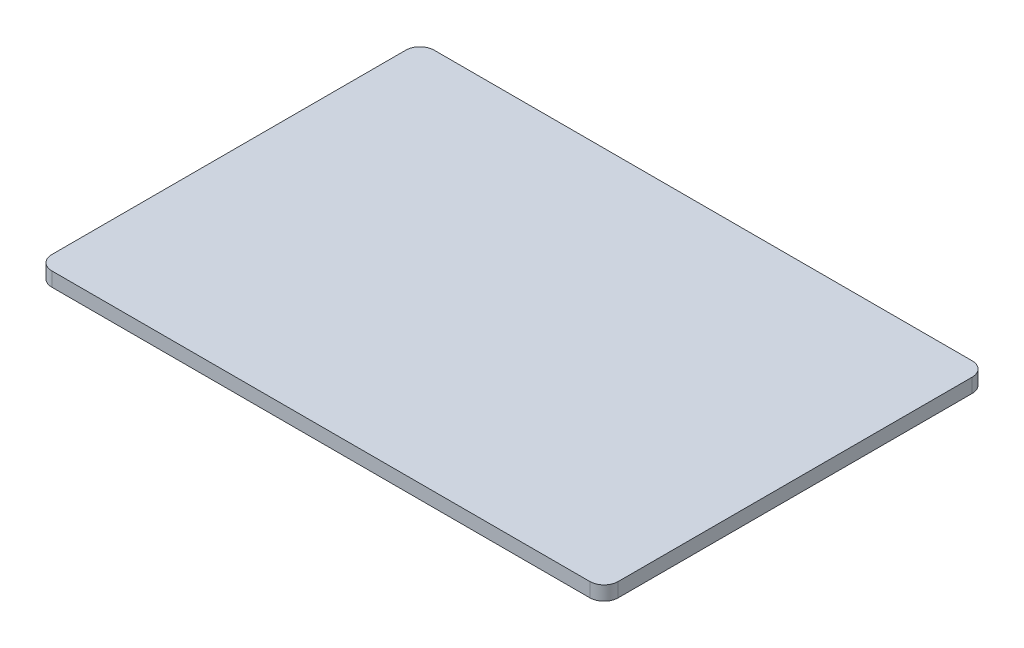
ISO-10303-21;
HEADER;
FILE_DESCRIPTION(('STEP AP214'),'2;1');
FILE_NAME('part.step','',(''),(''),'','','');
FILE_SCHEMA(('AUTOMOTIVE_DESIGN { 1 0 10303 214 1 1 1 1 }'));
ENDSEC;
DATA;
#1=APPLICATION_CONTEXT('core data for automotive mechanical design processes');
#2=APPLICATION_PROTOCOL_DEFINITION('international standard','automotive_design',2000,#1);
#3=PRODUCT_CONTEXT('',#1,'mechanical');
#4=PRODUCT('Part','Part','',(#3));
#5=PRODUCT_RELATED_PRODUCT_CATEGORY('part','',(#4));
#6=PRODUCT_DEFINITION_FORMATION('','',#4);
#7=PRODUCT_DEFINITION_CONTEXT('part definition',#1,'design');
#8=PRODUCT_DEFINITION('design','',#6,#7);
#9=PRODUCT_DEFINITION_SHAPE('','',#8);
#10=(LENGTH_UNIT() NAMED_UNIT(*) SI_UNIT(.MILLI.,.METRE.));
#11=(NAMED_UNIT(*) PLANE_ANGLE_UNIT() SI_UNIT($,.RADIAN.));
#12=(NAMED_UNIT(*) SI_UNIT($,.STERADIAN.) SOLID_ANGLE_UNIT());
#13=UNCERTAINTY_MEASURE_WITH_UNIT(LENGTH_MEASURE(1.E-05),#10,'distance_accuracy_value','');
#14=(GEOMETRIC_REPRESENTATION_CONTEXT(3) GLOBAL_UNCERTAINTY_ASSIGNED_CONTEXT((#13)) GLOBAL_UNIT_ASSIGNED_CONTEXT((#10,
#11,#12)) REPRESENTATION_CONTEXT('',''));
#15=CARTESIAN_POINT('',(0.,0.,0.));
#16=DIRECTION('',(0.,0.,1.));
#17=DIRECTION('',(1.,0.,0.));
#18=AXIS2_PLACEMENT_3D('',#15,#16,#17);
#19=CARTESIAN_POINT('',(20.,0.,13.5));
#20=DIRECTION('',(0.,1.,0.));
#21=DIRECTION('',(1.,0.,0.));
#22=AXIS2_PLACEMENT_3D('',#19,#20,#21);
#23=PLANE('',#22);
#24=CARTESIAN_POINT('',(1.,0.,1.));
#25=DIRECTION('',(0.,1.,0.));
#26=DIRECTION('',(-0.707106781186548,0.,-0.707106781186547));
#27=AXIS2_PLACEMENT_3D('',#24,#25,#26);
#28=CIRCLE('',#27,1.);
#29=CARTESIAN_POINT('',(1.,0.,0.));
#30=VERTEX_POINT('',#29);
#31=CARTESIAN_POINT('',(0.,0.,1.));
#32=VERTEX_POINT('',#31);
#33=EDGE_CURVE('E112',#30,#32,#28,.T.);
#34=ORIENTED_EDGE('',*,*,#33,.F.);
#35=DIRECTION('',(1.,0.,0.));
#36=VECTOR('',#35,1.);
#37=CARTESIAN_POINT('',(0.,0.,0.));
#38=LINE('',#37,#36);
#39=CARTESIAN_POINT('',(39.,0.,0.));
#40=VERTEX_POINT('',#39);
#41=EDGE_CURVE('E105',#30,#40,#38,.T.);
#42=ORIENTED_EDGE('',*,*,#41,.T.);
#43=CARTESIAN_POINT('',(39.,0.,1.));
#44=DIRECTION('',(0.,1.,0.));
#45=DIRECTION('',(0.707106781186546,0.,-0.707106781186549));
#46=AXIS2_PLACEMENT_3D('',#43,#44,#45);
#47=CIRCLE('',#46,1.);
#48=CARTESIAN_POINT('',(40.,0.,1.));
#49=VERTEX_POINT('',#48);
#50=EDGE_CURVE('E141',#49,#40,#47,.T.);
#51=ORIENTED_EDGE('',*,*,#50,.F.);
#52=DIRECTION('',(0.,0.,1.));
#53=VECTOR('',#52,1.);
#54=CARTESIAN_POINT('',(40.,0.,0.));
#55=LINE('',#54,#53);
#56=CARTESIAN_POINT('',(40.,0.,26.));
#57=VERTEX_POINT('',#56);
#58=EDGE_CURVE('E159',#49,#57,#55,.T.);
#59=ORIENTED_EDGE('',*,*,#58,.T.);
#60=CARTESIAN_POINT('',(39.,0.,26.));
#61=DIRECTION('',(0.,1.,0.));
#62=DIRECTION('',(0.707106781186551,0.,0.707106781186544));
#63=AXIS2_PLACEMENT_3D('',#60,#61,#62);
#64=CIRCLE('',#63,1.);
#65=CARTESIAN_POINT('',(39.,0.,27.));
#66=VERTEX_POINT('',#65);
#67=EDGE_CURVE('E131',#66,#57,#64,.T.);
#68=ORIENTED_EDGE('',*,*,#67,.F.);
#69=DIRECTION('',(-1.,0.,0.));
#70=VECTOR('',#69,1.);
#71=CARTESIAN_POINT('',(40.,0.,27.));
#72=LINE('',#71,#70);
#73=CARTESIAN_POINT('',(1.,0.,27.));
#74=VERTEX_POINT('',#73);
#75=EDGE_CURVE('E130',#66,#74,#72,.T.);
#76=ORIENTED_EDGE('',*,*,#75,.T.);
#77=CARTESIAN_POINT('',(1.,0.,26.));
#78=DIRECTION('',(0.,1.,0.));
#79=DIRECTION('',(-0.707106781186546,0.,0.707106781186549));
#80=AXIS2_PLACEMENT_3D('',#77,#78,#79);
#81=CIRCLE('',#80,1.);
#82=CARTESIAN_POINT('',(0.,0.,26.));
#83=VERTEX_POINT('',#82);
#84=EDGE_CURVE('E27',#83,#74,#81,.T.);
#85=ORIENTED_EDGE('',*,*,#84,.F.);
#86=DIRECTION('',(0.,0.,-1.));
#87=VECTOR('',#86,1.);
#88=CARTESIAN_POINT('',(0.,0.,27.));
#89=LINE('',#88,#87);
#90=EDGE_CURVE('E11',#83,#32,#89,.T.);
#91=ORIENTED_EDGE('',*,*,#90,.T.);
#92=EDGE_LOOP('',(#34,#42,#51,#59,#68,#76,#85,#91));
#93=FACE_BOUND('',#92,.T.);
#94=ADVANCED_FACE('F16',(#93),#23,.F.);
#95=CARTESIAN_POINT('',(0.,0.,0.));
#96=DIRECTION('',(-1.,0.,0.));
#97=DIRECTION('',(0.,0.,1.));
#98=AXIS2_PLACEMENT_3D('',#95,#96,#97);
#99=PLANE('',#98);
#100=DIRECTION('',(0.,1.,0.));
#101=VECTOR('',#100,1.);
#102=CARTESIAN_POINT('',(0.,0.,1.));
#103=LINE('',#102,#101);
#104=CARTESIAN_POINT('',(0.,1.,1.));
#105=VERTEX_POINT('',#104);
#106=EDGE_CURVE('E97',#32,#105,#103,.T.);
#107=ORIENTED_EDGE('',*,*,#106,.F.);
#108=ORIENTED_EDGE('',*,*,#90,.F.);
#109=DIRECTION('',(0.,-1.,0.));
#110=VECTOR('',#109,1.);
#111=CARTESIAN_POINT('',(0.,0.,26.));
#112=LINE('',#111,#110);
#113=CARTESIAN_POINT('',(0.,1.,26.));
#114=VERTEX_POINT('',#113);
#115=EDGE_CURVE('E100',#114,#83,#112,.T.);
#116=ORIENTED_EDGE('',*,*,#115,.F.);
#117=DIRECTION('',(0.,0.,1.));
#118=VECTOR('',#117,1.);
#119=CARTESIAN_POINT('',(0.,1.,27.));
#120=LINE('',#119,#118);
#121=EDGE_CURVE('E94',#105,#114,#120,.T.);
#122=ORIENTED_EDGE('',*,*,#121,.F.);
#123=EDGE_LOOP('',(#107,#108,#116,#122));
#124=FACE_BOUND('',#123,.T.);
#125=ADVANCED_FACE('F96',(#124),#99,.T.);
#126=CARTESIAN_POINT('',(1.,0.,26.));
#127=DIRECTION('',(0.,1.,0.));
#128=DIRECTION('',(-0.707106781186546,0.,0.707106781186549));
#129=AXIS2_PLACEMENT_3D('',#126,#127,#128);
#130=CYLINDRICAL_SURFACE('',#129,1.);
#131=CARTESIAN_POINT('',(1.,1.,26.));
#132=DIRECTION('',(0.,-1.,0.));
#133=DIRECTION('',(-0.707106781186546,0.,0.707106781186549));
#134=AXIS2_PLACEMENT_3D('',#131,#132,#133);
#135=CIRCLE('',#134,1.);
#136=CARTESIAN_POINT('',(1.,1.,27.));
#137=VERTEX_POINT('',#136);
#138=EDGE_CURVE('E104',#137,#114,#135,.T.);
#139=ORIENTED_EDGE('',*,*,#138,.T.);
#140=ORIENTED_EDGE('',*,*,#115,.T.);
#141=ORIENTED_EDGE('',*,*,#84,.T.);
#142=DIRECTION('',(0.,1.,0.));
#143=VECTOR('',#142,1.);
#144=CARTESIAN_POINT('',(1.,0.,27.));
#145=LINE('',#144,#143);
#146=EDGE_CURVE('E127',#74,#137,#145,.T.);
#147=ORIENTED_EDGE('',*,*,#146,.T.);
#148=EDGE_LOOP('',(#139,#140,#141,#147));
#149=FACE_BOUND('',#148,.T.);
#150=ADVANCED_FACE('F185',(#149),#130,.T.);
#151=CARTESIAN_POINT('',(0.,0.,27.));
#152=DIRECTION('',(0.,0.,1.));
#153=DIRECTION('',(1.,0.,0.));
#154=AXIS2_PLACEMENT_3D('',#151,#152,#153);
#155=PLANE('',#154);
#156=DIRECTION('',(0.,-1.,0.));
#157=VECTOR('',#156,1.);
#158=CARTESIAN_POINT('',(39.,0.,27.));
#159=LINE('',#158,#157);
#160=CARTESIAN_POINT('',(39.,1.,27.));
#161=VERTEX_POINT('',#160);
#162=EDGE_CURVE('E158',#161,#66,#159,.T.);
#163=ORIENTED_EDGE('',*,*,#162,.F.);
#164=DIRECTION('',(1.,0.,0.));
#165=VECTOR('',#164,1.);
#166=CARTESIAN_POINT('',(40.,1.,27.));
#167=LINE('',#166,#165);
#168=EDGE_CURVE('E151',#137,#161,#167,.T.);
#169=ORIENTED_EDGE('',*,*,#168,.F.);
#170=ORIENTED_EDGE('',*,*,#146,.F.);
#171=ORIENTED_EDGE('',*,*,#75,.F.);
#172=EDGE_LOOP('',(#163,#169,#170,#171));
#173=FACE_BOUND('',#172,.T.);
#174=ADVANCED_FACE('F191',(#173),#155,.T.);
#175=CARTESIAN_POINT('',(39.,0.,26.));
#176=DIRECTION('',(0.,1.,0.));
#177=DIRECTION('',(0.707106781186551,0.,0.707106781186544));
#178=AXIS2_PLACEMENT_3D('',#175,#176,#177);
#179=CYLINDRICAL_SURFACE('',#178,1.);
#180=CARTESIAN_POINT('',(39.,1.,26.));
#181=DIRECTION('',(0.,-1.,0.));
#182=DIRECTION('',(0.707106781186551,0.,0.707106781186544));
#183=AXIS2_PLACEMENT_3D('',#180,#181,#182);
#184=CIRCLE('',#183,1.);
#185=CARTESIAN_POINT('',(40.,1.,26.));
#186=VERTEX_POINT('',#185);
#187=EDGE_CURVE('E150',#186,#161,#184,.T.);
#188=ORIENTED_EDGE('',*,*,#187,.T.);
#189=ORIENTED_EDGE('',*,*,#162,.T.);
#190=ORIENTED_EDGE('',*,*,#67,.T.);
#191=DIRECTION('',(0.,1.,0.));
#192=VECTOR('',#191,1.);
#193=CARTESIAN_POINT('',(40.,0.,26.));
#194=LINE('',#193,#192);
#195=EDGE_CURVE('E144',#57,#186,#194,.T.);
#196=ORIENTED_EDGE('',*,*,#195,.T.);
#197=EDGE_LOOP('',(#188,#189,#190,#196));
#198=FACE_BOUND('',#197,.T.);
#199=ADVANCED_FACE('F194',(#198),#179,.T.);
#200=CARTESIAN_POINT('',(40.,0.,27.));
#201=DIRECTION('',(1.,0.,0.));
#202=DIRECTION('',(0.,1.,0.));
#203=AXIS2_PLACEMENT_3D('',#200,#201,#202);
#204=PLANE('',#203);
#205=DIRECTION('',(0.,-1.,0.));
#206=VECTOR('',#205,1.);
#207=CARTESIAN_POINT('',(40.,0.,1.));
#208=LINE('',#207,#206);
#209=CARTESIAN_POINT('',(40.,1.,1.));
#210=VERTEX_POINT('',#209);
#211=EDGE_CURVE('E145',#210,#49,#208,.T.);
#212=ORIENTED_EDGE('',*,*,#211,.F.);
#213=DIRECTION('',(0.,0.,-1.));
#214=VECTOR('',#213,1.);
#215=CARTESIAN_POINT('',(40.,1.,0.));
#216=LINE('',#215,#214);
#217=EDGE_CURVE('E146',#186,#210,#216,.T.);
#218=ORIENTED_EDGE('',*,*,#217,.F.);
#219=ORIENTED_EDGE('',*,*,#195,.F.);
#220=ORIENTED_EDGE('',*,*,#58,.F.);
#221=EDGE_LOOP('',(#212,#218,#219,#220));
#222=FACE_BOUND('',#221,.T.);
#223=ADVANCED_FACE('F199',(#222),#204,.T.);
#224=CARTESIAN_POINT('',(39.,0.,1.));
#225=DIRECTION('',(0.,1.,0.));
#226=DIRECTION('',(0.707106781186546,0.,-0.707106781186549));
#227=AXIS2_PLACEMENT_3D('',#224,#225,#226);
#228=CYLINDRICAL_SURFACE('',#227,1.);
#229=CARTESIAN_POINT('',(39.,1.,1.));
#230=DIRECTION('',(0.,-1.,0.));
#231=DIRECTION('',(0.707106781186546,0.,-0.707106781186549));
#232=AXIS2_PLACEMENT_3D('',#229,#230,#231);
#233=CIRCLE('',#232,1.);
#234=CARTESIAN_POINT('',(39.,1.,0.));
#235=VERTEX_POINT('',#234);
#236=EDGE_CURVE('E20',#235,#210,#233,.T.);
#237=ORIENTED_EDGE('',*,*,#236,.T.);
#238=ORIENTED_EDGE('',*,*,#211,.T.);
#239=ORIENTED_EDGE('',*,*,#50,.T.);
#240=DIRECTION('',(0.,1.,0.));
#241=VECTOR('',#240,1.);
#242=CARTESIAN_POINT('',(39.,0.,0.));
#243=LINE('',#242,#241);
#244=EDGE_CURVE('E137',#40,#235,#243,.T.);
#245=ORIENTED_EDGE('',*,*,#244,.T.);
#246=EDGE_LOOP('',(#237,#238,#239,#245));
#247=FACE_BOUND('',#246,.T.);
#248=ADVANCED_FACE('F18',(#247),#228,.T.);
#249=CARTESIAN_POINT('',(20.,1.,13.5));
#250=DIRECTION('',(0.,1.,0.));
#251=DIRECTION('',(1.,0.,0.));
#252=AXIS2_PLACEMENT_3D('',#249,#250,#251);
#253=PLANE('',#252);
#254=CARTESIAN_POINT('',(1.,1.,1.));
#255=DIRECTION('',(0.,-1.,0.));
#256=DIRECTION('',(-0.707106781186548,0.,-0.707106781186547));
#257=AXIS2_PLACEMENT_3D('',#254,#255,#256);
#258=CIRCLE('',#257,1.);
#259=CARTESIAN_POINT('',(1.,1.,0.));
#260=VERTEX_POINT('',#259);
#261=EDGE_CURVE('E110',#105,#260,#258,.T.);
#262=ORIENTED_EDGE('',*,*,#261,.F.);
#263=ORIENTED_EDGE('',*,*,#121,.T.);
#264=ORIENTED_EDGE('',*,*,#138,.F.);
#265=ORIENTED_EDGE('',*,*,#168,.T.);
#266=ORIENTED_EDGE('',*,*,#187,.F.);
#267=ORIENTED_EDGE('',*,*,#217,.T.);
#268=ORIENTED_EDGE('',*,*,#236,.F.);
#269=DIRECTION('',(-1.,0.,0.));
#270=VECTOR('',#269,1.);
#271=CARTESIAN_POINT('',(0.,1.,0.));
#272=LINE('',#271,#270);
#273=EDGE_CURVE('E88',#235,#260,#272,.T.);
#274=ORIENTED_EDGE('',*,*,#273,.T.);
#275=EDGE_LOOP('',(#262,#263,#264,#265,#266,#267,#268,#274));
#276=FACE_BOUND('',#275,.T.);
#277=ADVANCED_FACE('F115',(#276),#253,.T.);
#278=CARTESIAN_POINT('',(40.,0.,0.));
#279=DIRECTION('',(0.,0.,-1.));
#280=DIRECTION('',(0.,-1.,0.));
#281=AXIS2_PLACEMENT_3D('',#278,#279,#280);
#282=PLANE('',#281);
#283=DIRECTION('',(0.,-1.,0.));
#284=VECTOR('',#283,1.);
#285=CARTESIAN_POINT('',(1.,0.,0.));
#286=LINE('',#285,#284);
#287=EDGE_CURVE('E117',#260,#30,#286,.T.);
#288=ORIENTED_EDGE('',*,*,#287,.F.);
#289=ORIENTED_EDGE('',*,*,#273,.F.);
#290=ORIENTED_EDGE('',*,*,#244,.F.);
#291=ORIENTED_EDGE('',*,*,#41,.F.);
#292=EDGE_LOOP('',(#288,#289,#290,#291));
#293=FACE_BOUND('',#292,.T.);
#294=ADVANCED_FACE('F330',(#293),#282,.T.);
#295=CARTESIAN_POINT('',(1.,0.,1.));
#296=DIRECTION('',(0.,1.,0.));
#297=DIRECTION('',(-0.707106781186548,0.,-0.707106781186547));
#298=AXIS2_PLACEMENT_3D('',#295,#296,#297);
#299=CYLINDRICAL_SURFACE('',#298,1.);
#300=ORIENTED_EDGE('',*,*,#261,.T.);
#301=ORIENTED_EDGE('',*,*,#287,.T.);
#302=ORIENTED_EDGE('',*,*,#33,.T.);
#303=ORIENTED_EDGE('',*,*,#106,.T.);
#304=EDGE_LOOP('',(#300,#301,#302,#303));
#305=FACE_BOUND('',#304,.T.);
#306=ADVANCED_FACE('F108',(#305),#299,.T.);
#307=CLOSED_SHELL('',(#94,#125,#150,#174,#199,#223,#248,#277,#294,#306));
#308=MANIFOLD_SOLID_BREP('B1',#307);
#309=ADVANCED_BREP_SHAPE_REPRESENTATION('',(#18,#308),#14);
#310=SHAPE_DEFINITION_REPRESENTATION(#9,#309);
ENDSEC;
END-ISO-10303-21;
